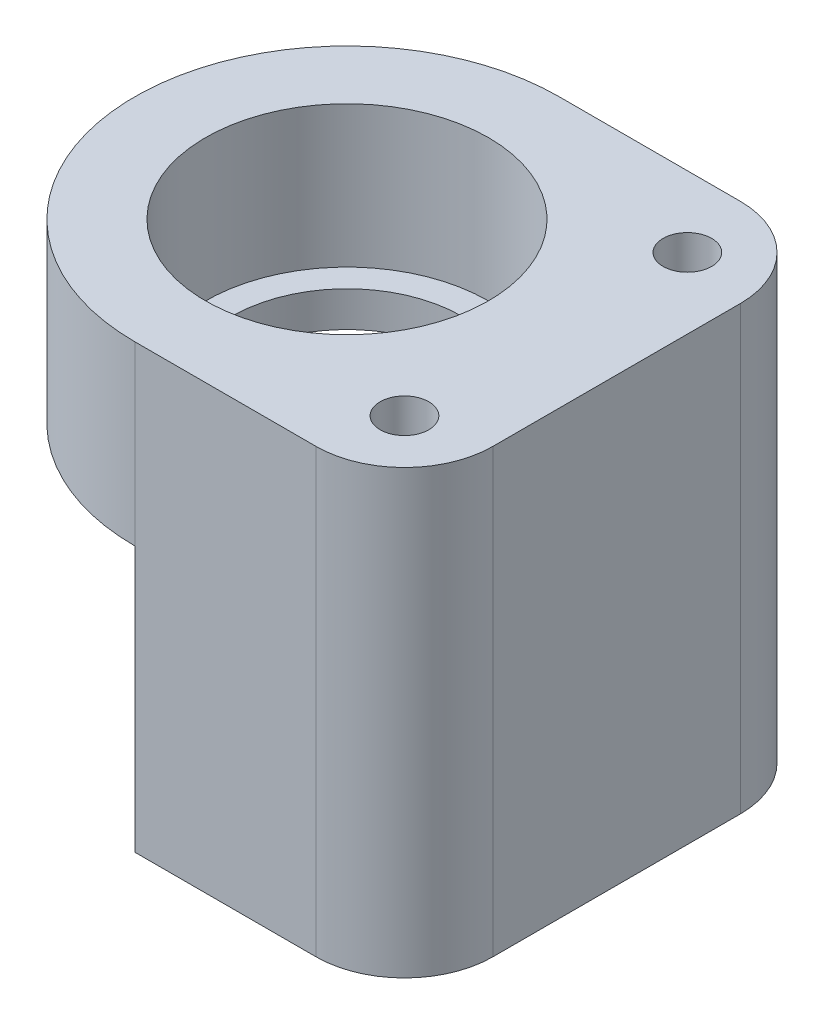
ISO-10303-21;
HEADER;
FILE_DESCRIPTION(('STEP AP214'),'2;1');
FILE_NAME('part.step','',(''),(''),'','','');
FILE_SCHEMA(('AUTOMOTIVE_DESIGN { 1 0 10303 214 1 1 1 1 }'));
ENDSEC;
DATA;
#1=APPLICATION_CONTEXT('core data for automotive mechanical design processes');
#2=APPLICATION_PROTOCOL_DEFINITION('international standard','automotive_design',2000,#1);
#3=PRODUCT_CONTEXT('',#1,'mechanical');
#4=PRODUCT('Part','Part','',(#3));
#5=PRODUCT_RELATED_PRODUCT_CATEGORY('part','',(#4));
#6=PRODUCT_DEFINITION_FORMATION('','',#4);
#7=PRODUCT_DEFINITION_CONTEXT('part definition',#1,'design');
#8=PRODUCT_DEFINITION('design','',#6,#7);
#9=PRODUCT_DEFINITION_SHAPE('','',#8);
#10=(LENGTH_UNIT() NAMED_UNIT(*) SI_UNIT(.MILLI.,.METRE.));
#11=(NAMED_UNIT(*) PLANE_ANGLE_UNIT() SI_UNIT($,.RADIAN.));
#12=(NAMED_UNIT(*) SI_UNIT($,.STERADIAN.) SOLID_ANGLE_UNIT());
#13=UNCERTAINTY_MEASURE_WITH_UNIT(LENGTH_MEASURE(1.E-05),#10,'distance_accuracy_value','');
#14=(GEOMETRIC_REPRESENTATION_CONTEXT(3) GLOBAL_UNCERTAINTY_ASSIGNED_CONTEXT((#13)) GLOBAL_UNIT_ASSIGNED_CONTEXT((#10,
#11,#12)) REPRESENTATION_CONTEXT('',''));
#15=CARTESIAN_POINT('',(0.,0.,0.));
#16=DIRECTION('',(0.,0.,1.));
#17=DIRECTION('',(1.,0.,0.));
#18=AXIS2_PLACEMENT_3D('',#15,#16,#17);
#19=CARTESIAN_POINT('',(-24.,0.,0.));
#20=DIRECTION('',(0.,1.,0.));
#21=DIRECTION('',(0.,0.,1.));
#22=AXIS2_PLACEMENT_3D('',#19,#20,#21);
#23=PLANE('',#22);
#24=CARTESIAN_POINT('',(22.5,0.,16.));
#25=DIRECTION('',(0.,-1.,0.));
#26=DIRECTION('',(0.,0.,-1.));
#27=AXIS2_PLACEMENT_3D('',#24,#25,#26);
#28=CIRCLE('',#27,2.74999999999999);
#29=CARTESIAN_POINT('',(22.5,0.,13.25));
#30=VERTEX_POINT('',#29);
#31=EDGE_CURVE('E250',#30,#30,#28,.T.);
#32=ORIENTED_EDGE('',*,*,#31,.F.);
#33=EDGE_LOOP('',(#32));
#34=FACE_BOUND('',#33,.T.);
#35=DIRECTION('',(0.,0.,-1.));
#36=VECTOR('',#35,1.);
#37=CARTESIAN_POINT('',(0.,0.,-24.));
#38=LINE('',#37,#36);
#39=CARTESIAN_POINT('',(0.,0.,-20.));
#40=VERTEX_POINT('',#39);
#41=CARTESIAN_POINT('',(0.,0.,-24.));
#42=VERTEX_POINT('',#41);
#43=EDGE_CURVE('E156',#40,#42,#38,.T.);
#44=ORIENTED_EDGE('',*,*,#43,.T.);
#45=DIRECTION('',(1.,0.,0.));
#46=VECTOR('',#45,1.);
#47=CARTESIAN_POINT('',(20.5,0.,-24.));
#48=LINE('',#47,#46);
#49=CARTESIAN_POINT('',(20.5,0.,-24.));
#50=VERTEX_POINT('',#49);
#51=EDGE_CURVE('E137',#42,#50,#48,.T.);
#52=ORIENTED_EDGE('',*,*,#51,.T.);
#53=CARTESIAN_POINT('',(20.5,0.,-14.));
#54=DIRECTION('',(0.,1.,0.));
#55=DIRECTION('',(0.,0.,1.));
#56=AXIS2_PLACEMENT_3D('',#53,#54,#55);
#57=CIRCLE('',#56,10.);
#58=CARTESIAN_POINT('',(30.5,0.,-14.));
#59=VERTEX_POINT('',#58);
#60=EDGE_CURVE('E239',#50,#59,#57,.F.);
#61=ORIENTED_EDGE('',*,*,#60,.T.);
#62=DIRECTION('',(0.,0.,1.));
#63=VECTOR('',#62,1.);
#64=CARTESIAN_POINT('',(30.5,0.,14.));
#65=LINE('',#64,#63);
#66=CARTESIAN_POINT('',(30.5,0.,14.));
#67=VERTEX_POINT('',#66);
#68=EDGE_CURVE('E240',#59,#67,#65,.T.);
#69=ORIENTED_EDGE('',*,*,#68,.T.);
#70=CARTESIAN_POINT('',(20.5,0.,14.));
#71=DIRECTION('',(0.,1.,0.));
#72=DIRECTION('',(0.,0.,1.));
#73=AXIS2_PLACEMENT_3D('',#70,#71,#72);
#74=CIRCLE('',#73,10.);
#75=CARTESIAN_POINT('',(20.5,0.,24.));
#76=VERTEX_POINT('',#75);
#77=EDGE_CURVE('E148',#67,#76,#74,.F.);
#78=ORIENTED_EDGE('',*,*,#77,.T.);
#79=DIRECTION('',(-1.,0.,0.));
#80=VECTOR('',#79,1.);
#81=CARTESIAN_POINT('',(0.,0.,24.));
#82=LINE('',#81,#80);
#83=CARTESIAN_POINT('',(0.,0.,24.));
#84=VERTEX_POINT('',#83);
#85=EDGE_CURVE('E115',#76,#84,#82,.T.);
#86=ORIENTED_EDGE('',*,*,#85,.T.);
#87=CARTESIAN_POINT('',(0.,0.,20.));
#88=VERTEX_POINT('',#87);
#89=EDGE_CURVE('E161',#84,#88,#38,.T.);
#90=ORIENTED_EDGE('',*,*,#89,.T.);
#91=CARTESIAN_POINT('',(0.,0.,0.));
#92=DIRECTION('',(0.,-1.,0.));
#93=DIRECTION('',(0.,0.,-1.));
#94=AXIS2_PLACEMENT_3D('',#91,#92,#93);
#95=CIRCLE('',#94,20.);
#96=EDGE_CURVE('E172',#40,#88,#95,.T.);
#97=ORIENTED_EDGE('',*,*,#96,.F.);
#98=EDGE_LOOP('',(#44,#52,#61,#69,#78,#86,#90,#97));
#99=FACE_BOUND('',#98,.T.);
#100=CARTESIAN_POINT('',(22.5,0.,-16.));
#101=DIRECTION('',(0.,-1.,0.));
#102=DIRECTION('',(0.,0.,-1.));
#103=AXIS2_PLACEMENT_3D('',#100,#101,#102);
#104=CIRCLE('',#103,2.74999999999999);
#105=CARTESIAN_POINT('',(22.5,0.,-18.75));
#106=VERTEX_POINT('',#105);
#107=EDGE_CURVE('E134',#106,#106,#104,.T.);
#108=ORIENTED_EDGE('',*,*,#107,.F.);
#109=EDGE_LOOP('',(#108));
#110=FACE_BOUND('',#109,.T.);
#111=ADVANCED_FACE('F38',(#34,#99,#110),#23,.F.);
#112=CARTESIAN_POINT('',(0.,0.,0.));
#113=DIRECTION('',(0.,-1.,0.));
#114=DIRECTION('',(0.,0.,-1.));
#115=AXIS2_PLACEMENT_3D('',#112,#113,#114);
#116=CYLINDRICAL_SURFACE('',#115,20.);
#117=DIRECTION('',(0.,-1.,0.));
#118=VECTOR('',#117,1.);
#119=CARTESIAN_POINT('',(0.,0.,-20.));
#120=LINE('',#119,#118);
#121=CARTESIAN_POINT('',(0.,30.,-20.));
#122=VERTEX_POINT('',#121);
#123=EDGE_CURVE('E169',#40,#122,#120,.F.);
#124=ORIENTED_EDGE('',*,*,#123,.F.);
#125=ORIENTED_EDGE('',*,*,#96,.T.);
#126=DIRECTION('',(0.,-1.,0.));
#127=VECTOR('',#126,1.);
#128=CARTESIAN_POINT('',(0.,0.,20.));
#129=LINE('',#128,#127);
#130=CARTESIAN_POINT('',(0.,30.,20.));
#131=VERTEX_POINT('',#130);
#132=EDGE_CURVE('E167',#131,#88,#129,.T.);
#133=ORIENTED_EDGE('',*,*,#132,.F.);
#134=CARTESIAN_POINT('',(0.,30.,0.));
#135=DIRECTION('',(0.,-1.,0.));
#136=DIRECTION('',(0.,0.,-1.));
#137=AXIS2_PLACEMENT_3D('',#134,#135,#136);
#138=CIRCLE('',#137,20.);
#139=EDGE_CURVE('E175',#122,#131,#138,.T.);
#140=ORIENTED_EDGE('',*,*,#139,.F.);
#141=EDGE_LOOP('',(#124,#125,#133,#140));
#142=FACE_BOUND('',#141,.T.);
#143=ADVANCED_FACE('F220',(#142),#116,.F.);
#144=CARTESIAN_POINT('',(0.,0.,0.));
#145=DIRECTION('',(0.,-1.,0.));
#146=DIRECTION('',(0.,0.,-1.));
#147=AXIS2_PLACEMENT_3D('',#144,#145,#146);
#148=CYLINDRICAL_SURFACE('',#147,24.);
#149=CARTESIAN_POINT('',(0.,50.,0.));
#150=DIRECTION('',(0.,-1.,0.));
#151=DIRECTION('',(0.,0.,-1.));
#152=AXIS2_PLACEMENT_3D('',#149,#150,#151);
#153=CIRCLE('',#152,24.);
#154=CARTESIAN_POINT('',(0.,50.,24.));
#155=VERTEX_POINT('',#154);
#156=CARTESIAN_POINT('',(0.,50.,-24.));
#157=VERTEX_POINT('',#156);
#158=EDGE_CURVE('E56',#155,#157,#153,.T.);
#159=ORIENTED_EDGE('',*,*,#158,.T.);
#160=DIRECTION('',(0.,1.,0.));
#161=VECTOR('',#160,1.);
#162=CARTESIAN_POINT('',(0.,-56.8704668523127,-24.));
#163=LINE('',#162,#161);
#164=CARTESIAN_POINT('',(0.,30.,-24.));
#165=VERTEX_POINT('',#164);
#166=EDGE_CURVE('E146',#165,#157,#163,.T.);
#167=ORIENTED_EDGE('',*,*,#166,.F.);
#168=CARTESIAN_POINT('',(0.,30.,0.));
#169=DIRECTION('',(0.,1.,0.));
#170=DIRECTION('',(0.,0.,1.));
#171=AXIS2_PLACEMENT_3D('',#168,#169,#170);
#172=CIRCLE('',#171,24.);
#173=CARTESIAN_POINT('',(0.,30.,24.));
#174=VERTEX_POINT('',#173);
#175=EDGE_CURVE('E11',#165,#174,#172,.T.);
#176=ORIENTED_EDGE('',*,*,#175,.T.);
#177=DIRECTION('',(0.,1.,0.));
#178=VECTOR('',#177,1.);
#179=CARTESIAN_POINT('',(0.,-56.8704668523127,24.));
#180=LINE('',#179,#178);
#181=EDGE_CURVE('E52',#174,#155,#180,.T.);
#182=ORIENTED_EDGE('',*,*,#181,.T.);
#183=EDGE_LOOP('',(#159,#167,#176,#182));
#184=FACE_BOUND('',#183,.T.);
#185=ADVANCED_FACE('F228',(#184),#148,.T.);
#186=CARTESIAN_POINT('',(-16.,50.,0.));
#187=DIRECTION('',(0.,-1.,0.));
#188=DIRECTION('',(0.,0.,-1.));
#189=AXIS2_PLACEMENT_3D('',#186,#187,#188);
#190=PLANE('',#189);
#191=CARTESIAN_POINT('',(22.5,50.,16.));
#192=DIRECTION('',(0.,-1.,0.));
#193=DIRECTION('',(0.,0.,-1.));
#194=AXIS2_PLACEMENT_3D('',#191,#192,#193);
#195=CIRCLE('',#194,2.74999999999999);
#196=CARTESIAN_POINT('',(22.5,50.,13.25));
#197=VERTEX_POINT('',#196);
#198=EDGE_CURVE('E247',#197,#197,#195,.T.);
#199=ORIENTED_EDGE('',*,*,#198,.T.);
#200=EDGE_LOOP('',(#199));
#201=FACE_BOUND('',#200,.T.);
#202=CARTESIAN_POINT('',(22.5,50.,-16.));
#203=DIRECTION('',(0.,-1.,0.));
#204=DIRECTION('',(0.,0.,-1.));
#205=AXIS2_PLACEMENT_3D('',#202,#203,#204);
#206=CIRCLE('',#205,2.74999999999999);
#207=CARTESIAN_POINT('',(22.5,50.,-18.75));
#208=VERTEX_POINT('',#207);
#209=EDGE_CURVE('E131',#208,#208,#206,.T.);
#210=ORIENTED_EDGE('',*,*,#209,.T.);
#211=EDGE_LOOP('',(#210));
#212=FACE_BOUND('',#211,.T.);
#213=ORIENTED_EDGE('',*,*,#158,.F.);
#214=DIRECTION('',(1.,0.,0.));
#215=VECTOR('',#214,1.);
#216=CARTESIAN_POINT('',(0.,50.,24.));
#217=LINE('',#216,#215);
#218=CARTESIAN_POINT('',(20.5,50.,24.));
#219=VERTEX_POINT('',#218);
#220=EDGE_CURVE('E112',#155,#219,#217,.T.);
#221=ORIENTED_EDGE('',*,*,#220,.T.);
#222=CARTESIAN_POINT('',(20.5,50.,14.));
#223=DIRECTION('',(0.,1.,0.));
#224=DIRECTION('',(0.,0.,1.));
#225=AXIS2_PLACEMENT_3D('',#222,#223,#224);
#226=CIRCLE('',#225,10.);
#227=CARTESIAN_POINT('',(30.5,50.,14.));
#228=VERTEX_POINT('',#227);
#229=EDGE_CURVE('E121',#219,#228,#226,.T.);
#230=ORIENTED_EDGE('',*,*,#229,.T.);
#231=DIRECTION('',(0.,0.,-1.));
#232=VECTOR('',#231,1.);
#233=CARTESIAN_POINT('',(30.5,50.,14.));
#234=LINE('',#233,#232);
#235=CARTESIAN_POINT('',(30.5,50.,-14.));
#236=VERTEX_POINT('',#235);
#237=EDGE_CURVE('E127',#228,#236,#234,.T.);
#238=ORIENTED_EDGE('',*,*,#237,.T.);
#239=CARTESIAN_POINT('',(20.5,50.,-14.));
#240=DIRECTION('',(0.,1.,0.));
#241=DIRECTION('',(0.,0.,1.));
#242=AXIS2_PLACEMENT_3D('',#239,#240,#241);
#243=CIRCLE('',#242,10.);
#244=CARTESIAN_POINT('',(20.5,50.,-24.));
#245=VERTEX_POINT('',#244);
#246=EDGE_CURVE('E141',#236,#245,#243,.T.);
#247=ORIENTED_EDGE('',*,*,#246,.T.);
#248=DIRECTION('',(-1.,0.,0.));
#249=VECTOR('',#248,1.);
#250=CARTESIAN_POINT('',(20.5,50.,-24.));
#251=LINE('',#250,#249);
#252=EDGE_CURVE('E144',#245,#157,#251,.T.);
#253=ORIENTED_EDGE('',*,*,#252,.T.);
#254=EDGE_LOOP('',(#213,#221,#230,#238,#247,#253));
#255=FACE_BOUND('',#254,.T.);
#256=CARTESIAN_POINT('',(0.,50.,0.));
#257=DIRECTION('',(0.,-1.,0.));
#258=DIRECTION('',(0.,0.,-1.));
#259=AXIS2_PLACEMENT_3D('',#256,#257,#258);
#260=CIRCLE('',#259,16.);
#261=CARTESIAN_POINT('',(0.,50.,-16.));
#262=VERTEX_POINT('',#261);
#263=EDGE_CURVE('E46',#262,#262,#260,.T.);
#264=ORIENTED_EDGE('',*,*,#263,.T.);
#265=EDGE_LOOP('',(#264));
#266=FACE_BOUND('',#265,.T.);
#267=ADVANCED_FACE('F40',(#201,#212,#255,#266),#190,.F.);
#268=CARTESIAN_POINT('',(0.,0.,0.));
#269=DIRECTION('',(0.,-1.,0.));
#270=DIRECTION('',(0.,0.,-1.));
#271=AXIS2_PLACEMENT_3D('',#268,#269,#270);
#272=CYLINDRICAL_SURFACE('',#271,16.);
#273=ORIENTED_EDGE('',*,*,#263,.F.);
#274=EDGE_LOOP('',(#273));
#275=FACE_BOUND('',#274,.T.);
#276=CARTESIAN_POINT('',(0.,34.,0.));
#277=DIRECTION('',(0.,-1.,0.));
#278=DIRECTION('',(0.,0.,-1.));
#279=AXIS2_PLACEMENT_3D('',#276,#277,#278);
#280=CIRCLE('',#279,16.);
#281=CARTESIAN_POINT('',(0.,34.,-16.));
#282=VERTEX_POINT('',#281);
#283=EDGE_CURVE('E184',#282,#282,#280,.T.);
#284=ORIENTED_EDGE('',*,*,#283,.T.);
#285=EDGE_LOOP('',(#284));
#286=FACE_BOUND('',#285,.T.);
#287=ADVANCED_FACE('F189',(#275,#286),#272,.F.);
#288=CARTESIAN_POINT('',(-13.,34.,0.));
#289=DIRECTION('',(0.,-1.,0.));
#290=DIRECTION('',(0.,0.,-1.));
#291=AXIS2_PLACEMENT_3D('',#288,#289,#290);
#292=PLANE('',#291);
#293=ORIENTED_EDGE('',*,*,#283,.F.);
#294=EDGE_LOOP('',(#293));
#295=FACE_BOUND('',#294,.T.);
#296=CARTESIAN_POINT('',(0.,34.,0.));
#297=DIRECTION('',(0.,-1.,0.));
#298=DIRECTION('',(0.,0.,-1.));
#299=AXIS2_PLACEMENT_3D('',#296,#297,#298);
#300=CIRCLE('',#299,13.);
#301=CARTESIAN_POINT('',(0.,34.,-13.));
#302=VERTEX_POINT('',#301);
#303=EDGE_CURVE('E181',#302,#302,#300,.T.);
#304=ORIENTED_EDGE('',*,*,#303,.T.);
#305=EDGE_LOOP('',(#304));
#306=FACE_BOUND('',#305,.T.);
#307=ADVANCED_FACE('F192',(#295,#306),#292,.F.);
#308=CARTESIAN_POINT('',(0.,0.,0.));
#309=DIRECTION('',(0.,-1.,0.));
#310=DIRECTION('',(0.,0.,-1.));
#311=AXIS2_PLACEMENT_3D('',#308,#309,#310);
#312=CYLINDRICAL_SURFACE('',#311,13.);
#313=ORIENTED_EDGE('',*,*,#303,.F.);
#314=EDGE_LOOP('',(#313));
#315=FACE_BOUND('',#314,.T.);
#316=CARTESIAN_POINT('',(0.,30.,0.));
#317=DIRECTION('',(0.,-1.,0.));
#318=DIRECTION('',(0.,0.,-1.));
#319=AXIS2_PLACEMENT_3D('',#316,#317,#318);
#320=CIRCLE('',#319,13.);
#321=CARTESIAN_POINT('',(0.,30.,-13.));
#322=VERTEX_POINT('',#321);
#323=EDGE_CURVE('E178',#322,#322,#320,.T.);
#324=ORIENTED_EDGE('',*,*,#323,.T.);
#325=EDGE_LOOP('',(#324));
#326=FACE_BOUND('',#325,.T.);
#327=ADVANCED_FACE('F197',(#315,#326),#312,.F.);
#328=CARTESIAN_POINT('',(-20.,30.,0.));
#329=DIRECTION('',(0.,1.,0.));
#330=DIRECTION('',(0.,0.,1.));
#331=AXIS2_PLACEMENT_3D('',#328,#329,#330);
#332=PLANE('',#331);
#333=ORIENTED_EDGE('',*,*,#323,.F.);
#334=EDGE_LOOP('',(#333));
#335=FACE_BOUND('',#334,.T.);
#336=DIRECTION('',(0.,0.,-1.));
#337=VECTOR('',#336,1.);
#338=CARTESIAN_POINT('',(0.,30.,-24.));
#339=LINE('',#338,#337);
#340=EDGE_CURVE('E160',#122,#165,#339,.T.);
#341=ORIENTED_EDGE('',*,*,#340,.F.);
#342=ORIENTED_EDGE('',*,*,#139,.T.);
#343=EDGE_CURVE('E157',#174,#131,#339,.T.);
#344=ORIENTED_EDGE('',*,*,#343,.F.);
#345=ORIENTED_EDGE('',*,*,#175,.F.);
#346=EDGE_LOOP('',(#341,#342,#344,#345));
#347=FACE_BOUND('',#346,.T.);
#348=ADVANCED_FACE('F203',(#335,#347),#332,.F.);
#349=CARTESIAN_POINT('',(0.,30.,-24.));
#350=DIRECTION('',(-1.,0.,0.));
#351=DIRECTION('',(0.,0.,1.));
#352=AXIS2_PLACEMENT_3D('',#349,#350,#351);
#353=PLANE('',#352);
#354=ORIENTED_EDGE('',*,*,#123,.T.);
#355=ORIENTED_EDGE('',*,*,#340,.T.);
#356=DIRECTION('',(0.,-1.,0.));
#357=VECTOR('',#356,1.);
#358=CARTESIAN_POINT('',(0.,30.,-24.));
#359=LINE('',#358,#357);
#360=EDGE_CURVE('E159',#165,#42,#359,.T.);
#361=ORIENTED_EDGE('',*,*,#360,.T.);
#362=ORIENTED_EDGE('',*,*,#43,.F.);
#363=EDGE_LOOP('',(#354,#355,#361,#362));
#364=FACE_BOUND('',#363,.T.);
#365=ADVANCED_FACE('F209',(#364),#353,.T.);
#366=ORIENTED_EDGE('',*,*,#132,.T.);
#367=ORIENTED_EDGE('',*,*,#89,.F.);
#368=DIRECTION('',(0.,-1.,0.));
#369=VECTOR('',#368,1.);
#370=CARTESIAN_POINT('',(0.,30.,24.));
#371=LINE('',#370,#369);
#372=EDGE_CURVE('E165',#174,#84,#371,.T.);
#373=ORIENTED_EDGE('',*,*,#372,.F.);
#374=ORIENTED_EDGE('',*,*,#343,.T.);
#375=EDGE_LOOP('',(#366,#367,#373,#374));
#376=FACE_BOUND('',#375,.T.);
#377=ADVANCED_FACE('F223',(#376),#353,.T.);
#378=CARTESIAN_POINT('',(20.5,-56.8704668523127,-24.));
#379=DIRECTION('',(0.,0.,-1.));
#380=DIRECTION('',(-1.,0.,0.));
#381=AXIS2_PLACEMENT_3D('',#378,#379,#380);
#382=PLANE('',#381);
#383=ORIENTED_EDGE('',*,*,#51,.F.);
#384=ORIENTED_EDGE('',*,*,#360,.F.);
#385=ORIENTED_EDGE('',*,*,#166,.T.);
#386=ORIENTED_EDGE('',*,*,#252,.F.);
#387=DIRECTION('',(0.,1.,0.));
#388=VECTOR('',#387,1.);
#389=CARTESIAN_POINT('',(20.5,-56.8704668523127,-24.));
#390=LINE('',#389,#388);
#391=EDGE_CURVE('E149',#50,#245,#390,.T.);
#392=ORIENTED_EDGE('',*,*,#391,.F.);
#393=EDGE_LOOP('',(#383,#384,#385,#386,#392));
#394=FACE_BOUND('',#393,.T.);
#395=ADVANCED_FACE('F232',(#394),#382,.T.);
#396=CARTESIAN_POINT('',(20.5,-56.8704668523127,-14.));
#397=DIRECTION('',(0.,1.,0.));
#398=DIRECTION('',(0.,0.,1.));
#399=AXIS2_PLACEMENT_3D('',#396,#397,#398);
#400=CYLINDRICAL_SURFACE('',#399,10.);
#401=ORIENTED_EDGE('',*,*,#60,.F.);
#402=ORIENTED_EDGE('',*,*,#391,.T.);
#403=ORIENTED_EDGE('',*,*,#246,.F.);
#404=DIRECTION('',(0.,1.,0.));
#405=VECTOR('',#404,1.);
#406=CARTESIAN_POINT('',(30.5,-56.8704668523127,-14.));
#407=LINE('',#406,#405);
#408=EDGE_CURVE('E151',#59,#236,#407,.T.);
#409=ORIENTED_EDGE('',*,*,#408,.F.);
#410=EDGE_LOOP('',(#401,#402,#403,#409));
#411=FACE_BOUND('',#410,.T.);
#412=ADVANCED_FACE('F238',(#411),#400,.T.);
#413=CARTESIAN_POINT('',(30.5,-56.8704668523127,14.));
#414=DIRECTION('',(1.,0.,0.));
#415=DIRECTION('',(0.,0.,-1.));
#416=AXIS2_PLACEMENT_3D('',#413,#414,#415);
#417=PLANE('',#416);
#418=ORIENTED_EDGE('',*,*,#68,.F.);
#419=ORIENTED_EDGE('',*,*,#408,.T.);
#420=ORIENTED_EDGE('',*,*,#237,.F.);
#421=DIRECTION('',(0.,1.,0.));
#422=VECTOR('',#421,1.);
#423=CARTESIAN_POINT('',(30.5,-56.8704668523127,14.));
#424=LINE('',#423,#422);
#425=EDGE_CURVE('E118',#67,#228,#424,.T.);
#426=ORIENTED_EDGE('',*,*,#425,.F.);
#427=EDGE_LOOP('',(#418,#419,#420,#426));
#428=FACE_BOUND('',#427,.T.);
#429=ADVANCED_FACE('F272',(#428),#417,.T.);
#430=CARTESIAN_POINT('',(20.5,-56.8704668523127,14.));
#431=DIRECTION('',(0.,1.,0.));
#432=DIRECTION('',(0.,0.,1.));
#433=AXIS2_PLACEMENT_3D('',#430,#431,#432);
#434=CYLINDRICAL_SURFACE('',#433,10.);
#435=ORIENTED_EDGE('',*,*,#77,.F.);
#436=ORIENTED_EDGE('',*,*,#425,.T.);
#437=ORIENTED_EDGE('',*,*,#229,.F.);
#438=DIRECTION('',(0.,1.,0.));
#439=VECTOR('',#438,1.);
#440=CARTESIAN_POINT('',(20.5,-56.8704668523127,24.));
#441=LINE('',#440,#439);
#442=EDGE_CURVE('E108',#76,#219,#441,.T.);
#443=ORIENTED_EDGE('',*,*,#442,.F.);
#444=EDGE_LOOP('',(#435,#436,#437,#443));
#445=FACE_BOUND('',#444,.T.);
#446=ADVANCED_FACE('F122',(#445),#434,.T.);
#447=CARTESIAN_POINT('',(0.,-56.8704668523127,24.));
#448=DIRECTION('',(0.,0.,1.));
#449=DIRECTION('',(1.,0.,0.));
#450=AXIS2_PLACEMENT_3D('',#447,#448,#449);
#451=PLANE('',#450);
#452=ORIENTED_EDGE('',*,*,#85,.F.);
#453=ORIENTED_EDGE('',*,*,#442,.T.);
#454=ORIENTED_EDGE('',*,*,#220,.F.);
#455=ORIENTED_EDGE('',*,*,#181,.F.);
#456=ORIENTED_EDGE('',*,*,#372,.T.);
#457=EDGE_LOOP('',(#452,#453,#454,#455,#456));
#458=FACE_BOUND('',#457,.T.);
#459=ADVANCED_FACE('F110',(#458),#451,.T.);
#460=CARTESIAN_POINT('',(22.5,0.,-16.));
#461=DIRECTION('',(0.,-1.,0.));
#462=DIRECTION('',(0.,0.,-1.));
#463=AXIS2_PLACEMENT_3D('',#460,#461,#462);
#464=CYLINDRICAL_SURFACE('',#463,2.74999999999999);
#465=ORIENTED_EDGE('',*,*,#209,.F.);
#466=EDGE_LOOP('',(#465));
#467=FACE_BOUND('',#466,.T.);
#468=ORIENTED_EDGE('',*,*,#107,.T.);
#469=EDGE_LOOP('',(#468));
#470=FACE_BOUND('',#469,.T.);
#471=ADVANCED_FACE('F269',(#467,#470),#464,.F.);
#472=CARTESIAN_POINT('',(22.5,0.,16.));
#473=DIRECTION('',(0.,-1.,0.));
#474=DIRECTION('',(0.,0.,-1.));
#475=AXIS2_PLACEMENT_3D('',#472,#473,#474);
#476=CYLINDRICAL_SURFACE('',#475,2.74999999999999);
#477=ORIENTED_EDGE('',*,*,#198,.F.);
#478=EDGE_LOOP('',(#477));
#479=FACE_BOUND('',#478,.T.);
#480=ORIENTED_EDGE('',*,*,#31,.T.);
#481=EDGE_LOOP('',(#480));
#482=FACE_BOUND('',#481,.T.);
#483=ADVANCED_FACE('F254',(#479,#482),#476,.F.);
#484=CLOSED_SHELL('',(#111,#143,#185,#267,#287,#307,#327,#348,#365,#377,#395,#412,#429,#446,
#459,#471,#483));
#485=MANIFOLD_SOLID_BREP('B2',#484);
#486=ADVANCED_BREP_SHAPE_REPRESENTATION('',(#18,#485),#14);
#487=SHAPE_DEFINITION_REPRESENTATION(#9,#486);
ENDSEC;
END-ISO-10303-21;
